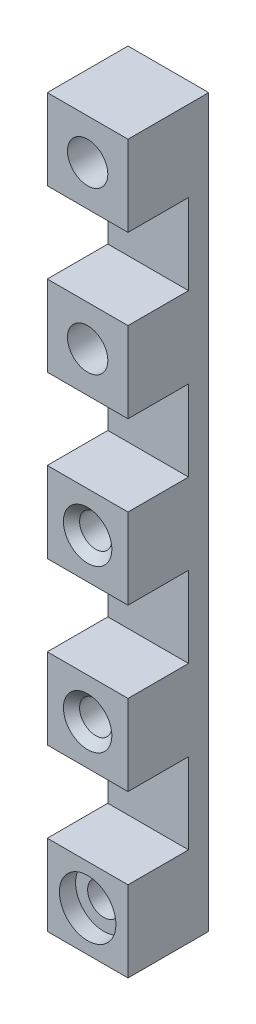
ISO-10303-21;
HEADER;
FILE_DESCRIPTION(('STEP AP214'),'2;1');
FILE_NAME('part.step','',(''),(''),'','','');
FILE_SCHEMA(('AUTOMOTIVE_DESIGN { 1 0 10303 214 1 1 1 1 }'));
ENDSEC;
DATA;
#1=APPLICATION_CONTEXT('core data for automotive mechanical design processes');
#2=APPLICATION_PROTOCOL_DEFINITION('international standard','automotive_design',2000,#1);
#3=PRODUCT_CONTEXT('',#1,'mechanical');
#4=PRODUCT('Part','Part','',(#3));
#5=PRODUCT_RELATED_PRODUCT_CATEGORY('part','',(#4));
#6=PRODUCT_DEFINITION_FORMATION('','',#4);
#7=PRODUCT_DEFINITION_CONTEXT('part definition',#1,'design');
#8=PRODUCT_DEFINITION('design','',#6,#7);
#9=PRODUCT_DEFINITION_SHAPE('','',#8);
#10=(LENGTH_UNIT() NAMED_UNIT(*) SI_UNIT(.MILLI.,.METRE.));
#11=(NAMED_UNIT(*) PLANE_ANGLE_UNIT() SI_UNIT($,.RADIAN.));
#12=(NAMED_UNIT(*) SI_UNIT($,.STERADIAN.) SOLID_ANGLE_UNIT());
#13=UNCERTAINTY_MEASURE_WITH_UNIT(LENGTH_MEASURE(1.E-05),#10,'distance_accuracy_value','');
#14=(GEOMETRIC_REPRESENTATION_CONTEXT(3) GLOBAL_UNCERTAINTY_ASSIGNED_CONTEXT((#13)) GLOBAL_UNIT_ASSIGNED_CONTEXT((#10,
#11,#12)) REPRESENTATION_CONTEXT('',''));
#15=CARTESIAN_POINT('',(0.,0.,0.));
#16=DIRECTION('',(0.,0.,1.));
#17=DIRECTION('',(1.,0.,0.));
#18=AXIS2_PLACEMENT_3D('',#15,#16,#17);
#19=CARTESIAN_POINT('',(0.,0.,15.));
#20=DIRECTION('',(0.,1.,0.));
#21=DIRECTION('',(0.,0.,1.));
#22=AXIS2_PLACEMENT_3D('',#19,#20,#21);
#23=PLANE('',#22);
#24=DIRECTION('',(1.,0.,0.));
#25=VECTOR('',#24,1.);
#26=CARTESIAN_POINT('',(0.,0.,0.));
#27=LINE('',#26,#25);
#28=CARTESIAN_POINT('',(-10.,0.,0.));
#29=VERTEX_POINT('',#28);
#30=CARTESIAN_POINT('',(10.,0.,0.));
#31=VERTEX_POINT('',#30);
#32=EDGE_CURVE('E343',#29,#31,#27,.T.);
#33=ORIENTED_EDGE('',*,*,#32,.T.);
#34=DIRECTION('',(0.,0.,-1.));
#35=VECTOR('',#34,1.);
#36=CARTESIAN_POINT('',(10.,0.,15.));
#37=LINE('',#36,#35);
#38=CARTESIAN_POINT('',(10.,0.,15.));
#39=VERTEX_POINT('',#38);
#40=EDGE_CURVE('E11',#39,#31,#37,.T.);
#41=ORIENTED_EDGE('',*,*,#40,.F.);
#42=DIRECTION('',(1.,0.,0.));
#43=VECTOR('',#42,1.);
#44=CARTESIAN_POINT('',(0.,0.,15.));
#45=LINE('',#44,#43);
#46=CARTESIAN_POINT('',(-9.99999999999999,0.,15.));
#47=VERTEX_POINT('',#46);
#48=EDGE_CURVE('E347',#47,#39,#45,.T.);
#49=ORIENTED_EDGE('',*,*,#48,.F.);
#50=DIRECTION('',(0.,0.,-1.));
#51=VECTOR('',#50,1.);
#52=CARTESIAN_POINT('',(-9.99999999999999,0.,15.));
#53=LINE('',#52,#51);
#54=EDGE_CURVE('E56',#47,#29,#53,.T.);
#55=ORIENTED_EDGE('',*,*,#54,.T.);
#56=EDGE_LOOP('',(#33,#41,#49,#55));
#57=FACE_BOUND('',#56,.T.);
#58=ADVANCED_FACE('F38',(#57),#23,.F.);
#59=CARTESIAN_POINT('',(9.99999999999999,0.,15.));
#60=DIRECTION('',(-1.,0.,0.));
#61=DIRECTION('',(0.,0.,1.));
#62=AXIS2_PLACEMENT_3D('',#59,#60,#61);
#63=PLANE('',#62);
#64=ORIENTED_EDGE('',*,*,#40,.T.);
#65=DIRECTION('',(0.,1.,0.));
#66=VECTOR('',#65,1.);
#67=CARTESIAN_POINT('',(9.99999999999999,0.,0.));
#68=LINE('',#67,#66);
#69=CARTESIAN_POINT('',(9.99999999999999,-20.,0.));
#70=VERTEX_POINT('',#69);
#71=EDGE_CURVE('E375',#70,#31,#68,.T.);
#72=ORIENTED_EDGE('',*,*,#71,.F.);
#73=DIRECTION('',(0.,0.,-1.));
#74=VECTOR('',#73,1.);
#75=CARTESIAN_POINT('',(9.99999999999999,-20.,15.));
#76=LINE('',#75,#74);
#77=CARTESIAN_POINT('',(9.99999999999999,-20.,15.));
#78=VERTEX_POINT('',#77);
#79=EDGE_CURVE('E394',#78,#70,#76,.T.);
#80=ORIENTED_EDGE('',*,*,#79,.F.);
#81=DIRECTION('',(0.,1.,0.));
#82=VECTOR('',#81,1.);
#83=CARTESIAN_POINT('',(9.99999999999999,-40.,15.));
#84=LINE('',#83,#82);
#85=CARTESIAN_POINT('',(10.,-40.,15.));
#86=VERTEX_POINT('',#85);
#87=EDGE_CURVE('E432',#86,#78,#84,.T.);
#88=ORIENTED_EDGE('',*,*,#87,.F.);
#89=DIRECTION('',(0.,0.,-1.));
#90=VECTOR('',#89,1.);
#91=CARTESIAN_POINT('',(10.,-40.,15.));
#92=LINE('',#91,#90);
#93=CARTESIAN_POINT('',(10.,-40.,0.));
#94=VERTEX_POINT('',#93);
#95=EDGE_CURVE('E389',#86,#94,#92,.T.);
#96=ORIENTED_EDGE('',*,*,#95,.T.);
#97=DIRECTION('',(0.,1.,0.));
#98=VECTOR('',#97,1.);
#99=CARTESIAN_POINT('',(9.99999999999999,-40.,0.));
#100=LINE('',#99,#98);
#101=CARTESIAN_POINT('',(9.99999999999999,-60.,0.));
#102=VERTEX_POINT('',#101);
#103=EDGE_CURVE('E412',#102,#94,#100,.T.);
#104=ORIENTED_EDGE('',*,*,#103,.F.);
#105=DIRECTION('',(0.,0.,-1.));
#106=VECTOR('',#105,1.);
#107=CARTESIAN_POINT('',(9.99999999999999,-60.,15.));
#108=LINE('',#107,#106);
#109=CARTESIAN_POINT('',(9.99999999999999,-60.,15.));
#110=VERTEX_POINT('',#109);
#111=EDGE_CURVE('E904',#110,#102,#108,.T.);
#112=ORIENTED_EDGE('',*,*,#111,.F.);
#113=DIRECTION('',(0.,1.,0.));
#114=VECTOR('',#113,1.);
#115=CARTESIAN_POINT('',(9.99999999999999,-80.,15.));
#116=LINE('',#115,#114);
#117=CARTESIAN_POINT('',(10.,-80.,15.));
#118=VERTEX_POINT('',#117);
#119=EDGE_CURVE('E932',#118,#110,#116,.T.);
#120=ORIENTED_EDGE('',*,*,#119,.F.);
#121=DIRECTION('',(0.,0.,-1.));
#122=VECTOR('',#121,1.);
#123=CARTESIAN_POINT('',(10.,-80.,15.));
#124=LINE('',#123,#122);
#125=CARTESIAN_POINT('',(10.,-80.,0.));
#126=VERTEX_POINT('',#125);
#127=EDGE_CURVE('E907',#118,#126,#124,.T.);
#128=ORIENTED_EDGE('',*,*,#127,.T.);
#129=DIRECTION('',(0.,1.,0.));
#130=VECTOR('',#129,1.);
#131=CARTESIAN_POINT('',(9.99999999999999,-80.,0.));
#132=LINE('',#131,#130);
#133=CARTESIAN_POINT('',(9.99999999999999,-100.,0.));
#134=VERTEX_POINT('',#133);
#135=EDGE_CURVE('E889',#134,#126,#132,.T.);
#136=ORIENTED_EDGE('',*,*,#135,.F.);
#137=DIRECTION('',(0.,0.,-1.));
#138=VECTOR('',#137,1.);
#139=CARTESIAN_POINT('',(9.99999999999999,-100.,15.));
#140=LINE('',#139,#138);
#141=CARTESIAN_POINT('',(9.99999999999999,-100.,15.));
#142=VERTEX_POINT('',#141);
#143=EDGE_CURVE('E278',#142,#134,#140,.T.);
#144=ORIENTED_EDGE('',*,*,#143,.F.);
#145=DIRECTION('',(0.,1.,0.));
#146=VECTOR('',#145,1.);
#147=CARTESIAN_POINT('',(9.99999999999999,-120.,15.));
#148=LINE('',#147,#146);
#149=CARTESIAN_POINT('',(10.,-120.,15.));
#150=VERTEX_POINT('',#149);
#151=EDGE_CURVE('E242',#150,#142,#148,.T.);
#152=ORIENTED_EDGE('',*,*,#151,.F.);
#153=DIRECTION('',(0.,0.,-1.));
#154=VECTOR('',#153,1.);
#155=CARTESIAN_POINT('',(10.,-120.,15.));
#156=LINE('',#155,#154);
#157=CARTESIAN_POINT('',(10.,-120.,0.));
#158=VERTEX_POINT('',#157);
#159=EDGE_CURVE('E272',#150,#158,#156,.T.);
#160=ORIENTED_EDGE('',*,*,#159,.T.);
#161=DIRECTION('',(0.,1.,0.));
#162=VECTOR('',#161,1.);
#163=CARTESIAN_POINT('',(9.99999999999999,-120.,0.));
#164=LINE('',#163,#162);
#165=CARTESIAN_POINT('',(9.99999999999999,-140.,0.));
#166=VERTEX_POINT('',#165);
#167=EDGE_CURVE('E236',#166,#158,#164,.T.);
#168=ORIENTED_EDGE('',*,*,#167,.F.);
#169=DIRECTION('',(0.,0.,-1.));
#170=VECTOR('',#169,1.);
#171=CARTESIAN_POINT('',(9.99999999999999,-140.,15.));
#172=LINE('',#171,#170);
#173=CARTESIAN_POINT('',(9.99999999999999,-140.,15.));
#174=VERTEX_POINT('',#173);
#175=EDGE_CURVE('E197',#174,#166,#172,.T.);
#176=ORIENTED_EDGE('',*,*,#175,.F.);
#177=DIRECTION('',(0.,1.,0.));
#178=VECTOR('',#177,1.);
#179=CARTESIAN_POINT('',(9.99999999999999,-160.,15.));
#180=LINE('',#179,#178);
#181=CARTESIAN_POINT('',(10.,-160.,15.));
#182=VERTEX_POINT('',#181);
#183=EDGE_CURVE('E192',#182,#174,#180,.T.);
#184=ORIENTED_EDGE('',*,*,#183,.F.);
#185=DIRECTION('',(0.,0.,-1.));
#186=VECTOR('',#185,1.);
#187=CARTESIAN_POINT('',(10.,-160.,15.));
#188=LINE('',#187,#186);
#189=CARTESIAN_POINT('',(10.,-160.,-5.));
#190=VERTEX_POINT('',#189);
#191=EDGE_CURVE('E189',#182,#190,#188,.T.);
#192=ORIENTED_EDGE('',*,*,#191,.T.);
#193=DIRECTION('',(0.,1.,0.));
#194=VECTOR('',#193,1.);
#195=CARTESIAN_POINT('',(9.99999999999999,0.,-5.));
#196=LINE('',#195,#194);
#197=CARTESIAN_POINT('',(9.99999999999999,20.,-5.));
#198=VERTEX_POINT('',#197);
#199=EDGE_CURVE('E175',#190,#198,#196,.T.);
#200=ORIENTED_EDGE('',*,*,#199,.T.);
#201=DIRECTION('',(0.,0.,-1.));
#202=VECTOR('',#201,1.);
#203=CARTESIAN_POINT('',(9.99999999999999,20.,15.));
#204=LINE('',#203,#202);
#205=CARTESIAN_POINT('',(9.99999999999999,20.,15.));
#206=VERTEX_POINT('',#205);
#207=EDGE_CURVE('E48',#206,#198,#204,.T.);
#208=ORIENTED_EDGE('',*,*,#207,.F.);
#209=DIRECTION('',(0.,1.,0.));
#210=VECTOR('',#209,1.);
#211=CARTESIAN_POINT('',(9.99999999999999,0.,15.));
#212=LINE('',#211,#210);
#213=EDGE_CURVE('E350',#39,#206,#212,.T.);
#214=ORIENTED_EDGE('',*,*,#213,.F.);
#215=EDGE_LOOP('',(#64,#72,#80,#88,#96,#104,#112,#120,#128,#136,#144,#152,#160,#168,#176,#184,
#192,#200,#208,#214));
#216=FACE_BOUND('',#215,.T.);
#217=ADVANCED_FACE('F190',(#216),#63,.F.);
#218=CARTESIAN_POINT('',(0.,20.,15.));
#219=DIRECTION('',(0.,1.,0.));
#220=DIRECTION('',(0.,0.,1.));
#221=AXIS2_PLACEMENT_3D('',#218,#219,#220);
#222=PLANE('',#221);
#223=ORIENTED_EDGE('',*,*,#207,.T.);
#224=DIRECTION('',(1.,0.,0.));
#225=VECTOR('',#224,1.);
#226=CARTESIAN_POINT('',(0.,20.,-5.));
#227=LINE('',#226,#225);
#228=CARTESIAN_POINT('',(-10.,20.,-5.));
#229=VERTEX_POINT('',#228);
#230=EDGE_CURVE('E183',#229,#198,#227,.T.);
#231=ORIENTED_EDGE('',*,*,#230,.F.);
#232=DIRECTION('',(0.,0.,-1.));
#233=VECTOR('',#232,1.);
#234=CARTESIAN_POINT('',(-10.,20.,15.));
#235=LINE('',#234,#233);
#236=CARTESIAN_POINT('',(-10.,20.,15.));
#237=VERTEX_POINT('',#236);
#238=EDGE_CURVE('E363',#237,#229,#235,.T.);
#239=ORIENTED_EDGE('',*,*,#238,.F.);
#240=DIRECTION('',(1.,0.,0.));
#241=VECTOR('',#240,1.);
#242=CARTESIAN_POINT('',(0.,20.,15.));
#243=LINE('',#242,#241);
#244=EDGE_CURVE('E368',#237,#206,#243,.T.);
#245=ORIENTED_EDGE('',*,*,#244,.T.);
#246=EDGE_LOOP('',(#223,#231,#239,#245));
#247=FACE_BOUND('',#246,.T.);
#248=ADVANCED_FACE('F340',(#247),#222,.T.);
#249=CARTESIAN_POINT('',(-10.,0.,15.));
#250=DIRECTION('',(-1.,0.,0.));
#251=DIRECTION('',(0.,0.,1.));
#252=AXIS2_PLACEMENT_3D('',#249,#250,#251);
#253=PLANE('',#252);
#254=ORIENTED_EDGE('',*,*,#238,.T.);
#255=DIRECTION('',(0.,1.,0.));
#256=VECTOR('',#255,1.);
#257=CARTESIAN_POINT('',(-10.,0.,-5.));
#258=LINE('',#257,#256);
#259=CARTESIAN_POINT('',(-10.,-160.,-5.));
#260=VERTEX_POINT('',#259);
#261=EDGE_CURVE('E186',#260,#229,#258,.T.);
#262=ORIENTED_EDGE('',*,*,#261,.F.);
#263=DIRECTION('',(0.,0.,-1.));
#264=VECTOR('',#263,1.);
#265=CARTESIAN_POINT('',(-9.99999999999999,-160.,15.));
#266=LINE('',#265,#264);
#267=CARTESIAN_POINT('',(-9.99999999999999,-160.,15.));
#268=VERTEX_POINT('',#267);
#269=EDGE_CURVE('E201',#268,#260,#266,.T.);
#270=ORIENTED_EDGE('',*,*,#269,.F.);
#271=DIRECTION('',(0.,1.,0.));
#272=VECTOR('',#271,1.);
#273=CARTESIAN_POINT('',(-10.,-160.,15.));
#274=LINE('',#273,#272);
#275=CARTESIAN_POINT('',(-10.,-140.,15.));
#276=VERTEX_POINT('',#275);
#277=EDGE_CURVE('E216',#268,#276,#274,.T.);
#278=ORIENTED_EDGE('',*,*,#277,.T.);
#279=DIRECTION('',(0.,0.,-1.));
#280=VECTOR('',#279,1.);
#281=CARTESIAN_POINT('',(-10.,-140.,15.));
#282=LINE('',#281,#280);
#283=CARTESIAN_POINT('',(-10.,-140.,0.));
#284=VERTEX_POINT('',#283);
#285=EDGE_CURVE('E221',#276,#284,#282,.T.);
#286=ORIENTED_EDGE('',*,*,#285,.T.);
#287=DIRECTION('',(0.,1.,0.));
#288=VECTOR('',#287,1.);
#289=CARTESIAN_POINT('',(-10.,-120.,0.));
#290=LINE('',#289,#288);
#291=CARTESIAN_POINT('',(-10.,-120.,0.));
#292=VERTEX_POINT('',#291);
#293=EDGE_CURVE('E231',#284,#292,#290,.T.);
#294=ORIENTED_EDGE('',*,*,#293,.T.);
#295=DIRECTION('',(0.,0.,-1.));
#296=VECTOR('',#295,1.);
#297=CARTESIAN_POINT('',(-9.99999999999999,-120.,15.));
#298=LINE('',#297,#296);
#299=CARTESIAN_POINT('',(-9.99999999999999,-120.,15.));
#300=VERTEX_POINT('',#299);
#301=EDGE_CURVE('E250',#300,#292,#298,.T.);
#302=ORIENTED_EDGE('',*,*,#301,.F.);
#303=DIRECTION('',(0.,1.,0.));
#304=VECTOR('',#303,1.);
#305=CARTESIAN_POINT('',(-10.,-120.,15.));
#306=LINE('',#305,#304);
#307=CARTESIAN_POINT('',(-10.,-100.,15.));
#308=VERTEX_POINT('',#307);
#309=EDGE_CURVE('E247',#300,#308,#306,.T.);
#310=ORIENTED_EDGE('',*,*,#309,.T.);
#311=DIRECTION('',(0.,0.,-1.));
#312=VECTOR('',#311,1.);
#313=CARTESIAN_POINT('',(-10.,-100.,15.));
#314=LINE('',#313,#312);
#315=CARTESIAN_POINT('',(-10.,-100.,0.));
#316=VERTEX_POINT('',#315);
#317=EDGE_CURVE('E263',#308,#316,#314,.T.);
#318=ORIENTED_EDGE('',*,*,#317,.T.);
#319=DIRECTION('',(0.,1.,0.));
#320=VECTOR('',#319,1.);
#321=CARTESIAN_POINT('',(-10.,-80.,0.));
#322=LINE('',#321,#320);
#323=CARTESIAN_POINT('',(-10.,-80.,0.));
#324=VERTEX_POINT('',#323);
#325=EDGE_CURVE('E882',#316,#324,#322,.T.);
#326=ORIENTED_EDGE('',*,*,#325,.T.);
#327=DIRECTION('',(0.,0.,-1.));
#328=VECTOR('',#327,1.);
#329=CARTESIAN_POINT('',(-9.99999999999999,-80.,15.));
#330=LINE('',#329,#328);
#331=CARTESIAN_POINT('',(-9.99999999999999,-80.,15.));
#332=VERTEX_POINT('',#331);
#333=EDGE_CURVE('E922',#332,#324,#330,.T.);
#334=ORIENTED_EDGE('',*,*,#333,.F.);
#335=DIRECTION('',(0.,1.,0.));
#336=VECTOR('',#335,1.);
#337=CARTESIAN_POINT('',(-10.,-80.,15.));
#338=LINE('',#337,#336);
#339=CARTESIAN_POINT('',(-10.,-60.,15.));
#340=VERTEX_POINT('',#339);
#341=EDGE_CURVE('E926',#332,#340,#338,.T.);
#342=ORIENTED_EDGE('',*,*,#341,.T.);
#343=DIRECTION('',(0.,0.,-1.));
#344=VECTOR('',#343,1.);
#345=CARTESIAN_POINT('',(-10.,-60.,15.));
#346=LINE('',#345,#344);
#347=CARTESIAN_POINT('',(-10.,-60.,0.));
#348=VERTEX_POINT('',#347);
#349=EDGE_CURVE('E908',#340,#348,#346,.T.);
#350=ORIENTED_EDGE('',*,*,#349,.T.);
#351=DIRECTION('',(0.,1.,0.));
#352=VECTOR('',#351,1.);
#353=CARTESIAN_POINT('',(-10.,-40.,0.));
#354=LINE('',#353,#352);
#355=CARTESIAN_POINT('',(-10.,-40.,0.));
#356=VERTEX_POINT('',#355);
#357=EDGE_CURVE('E420',#348,#356,#354,.T.);
#358=ORIENTED_EDGE('',*,*,#357,.T.);
#359=DIRECTION('',(0.,0.,-1.));
#360=VECTOR('',#359,1.);
#361=CARTESIAN_POINT('',(-9.99999999999999,-40.,15.));
#362=LINE('',#361,#360);
#363=CARTESIAN_POINT('',(-9.99999999999999,-40.,15.));
#364=VERTEX_POINT('',#363);
#365=EDGE_CURVE('E395',#364,#356,#362,.T.);
#366=ORIENTED_EDGE('',*,*,#365,.F.);
#367=DIRECTION('',(0.,1.,0.));
#368=VECTOR('',#367,1.);
#369=CARTESIAN_POINT('',(-10.,-40.,15.));
#370=LINE('',#369,#368);
#371=CARTESIAN_POINT('',(-10.,-20.,15.));
#372=VERTEX_POINT('',#371);
#373=EDGE_CURVE('E415',#364,#372,#370,.T.);
#374=ORIENTED_EDGE('',*,*,#373,.T.);
#375=DIRECTION('',(0.,0.,-1.));
#376=VECTOR('',#375,1.);
#377=CARTESIAN_POINT('',(-10.,-20.,15.));
#378=LINE('',#377,#376);
#379=CARTESIAN_POINT('',(-10.,-20.,0.));
#380=VERTEX_POINT('',#379);
#381=EDGE_CURVE('E390',#372,#380,#378,.T.);
#382=ORIENTED_EDGE('',*,*,#381,.T.);
#383=DIRECTION('',(0.,1.,0.));
#384=VECTOR('',#383,1.);
#385=CARTESIAN_POINT('',(-10.,0.,0.));
#386=LINE('',#385,#384);
#387=EDGE_CURVE('E378',#380,#29,#386,.T.);
#388=ORIENTED_EDGE('',*,*,#387,.T.);
#389=ORIENTED_EDGE('',*,*,#54,.F.);
#390=DIRECTION('',(0.,1.,0.));
#391=VECTOR('',#390,1.);
#392=CARTESIAN_POINT('',(-10.,0.,15.));
#393=LINE('',#392,#391);
#394=EDGE_CURVE('E361',#47,#237,#393,.T.);
#395=ORIENTED_EDGE('',*,*,#394,.T.);
#396=EDGE_LOOP('',(#254,#262,#270,#278,#286,#294,#302,#310,#318,#326,#334,#342,#350,#358,#366,
#374,#382,#388,#389,#395));
#397=FACE_BOUND('',#396,.T.);
#398=ADVANCED_FACE('F292',(#397),#253,.T.);
#399=CARTESIAN_POINT('',(0.,0.,15.));
#400=DIRECTION('',(0.,0.,1.));
#401=DIRECTION('',(1.,0.,0.));
#402=AXIS2_PLACEMENT_3D('',#399,#400,#401);
#403=PLANE('',#402);
#404=CARTESIAN_POINT('',(0.,10.,15.));
#405=DIRECTION('',(0.,0.,1.));
#406=DIRECTION('',(1.,0.,0.));
#407=AXIS2_PLACEMENT_3D('',#404,#405,#406);
#408=CIRCLE('',#407,5.);
#409=CARTESIAN_POINT('',(5.,10.,15.));
#410=VERTEX_POINT('',#409);
#411=EDGE_CURVE('E385',#410,#410,#408,.T.);
#412=ORIENTED_EDGE('',*,*,#411,.F.);
#413=EDGE_LOOP('',(#412));
#414=FACE_BOUND('',#413,.T.);
#415=ORIENTED_EDGE('',*,*,#48,.T.);
#416=ORIENTED_EDGE('',*,*,#213,.T.);
#417=ORIENTED_EDGE('',*,*,#244,.F.);
#418=ORIENTED_EDGE('',*,*,#394,.F.);
#419=EDGE_LOOP('',(#415,#416,#417,#418));
#420=FACE_BOUND('',#419,.T.);
#421=ADVANCED_FACE('F373',(#414,#420),#403,.T.);
#422=CARTESIAN_POINT('',(0.,0.,0.));
#423=DIRECTION('',(0.,0.,1.));
#424=DIRECTION('',(1.,0.,0.));
#425=AXIS2_PLACEMENT_3D('',#422,#423,#424);
#426=PLANE('',#425);
#427=ORIENTED_EDGE('',*,*,#32,.F.);
#428=ORIENTED_EDGE('',*,*,#387,.F.);
#429=DIRECTION('',(1.,0.,0.));
#430=VECTOR('',#429,1.);
#431=CARTESIAN_POINT('',(0.,-20.,0.));
#432=LINE('',#431,#430);
#433=EDGE_CURVE('E41',#380,#70,#432,.T.);
#434=ORIENTED_EDGE('',*,*,#433,.T.);
#435=ORIENTED_EDGE('',*,*,#71,.T.);
#436=EDGE_LOOP('',(#427,#428,#434,#435));
#437=FACE_BOUND('',#436,.T.);
#438=ADVANCED_FACE('F463',(#437),#426,.T.);
#439=CARTESIAN_POINT('',(0.,0.,-5.));
#440=DIRECTION('',(0.,0.,1.));
#441=DIRECTION('',(1.,0.,0.));
#442=AXIS2_PLACEMENT_3D('',#439,#440,#441);
#443=PLANE('',#442);
#444=CARTESIAN_POINT('',(0.,10.,-5.));
#445=DIRECTION('',(0.,0.,1.));
#446=DIRECTION('',(1.,0.,0.));
#447=AXIS2_PLACEMENT_3D('',#444,#445,#446);
#448=CIRCLE('',#447,5.);
#449=CARTESIAN_POINT('',(5.,10.,-5.));
#450=VERTEX_POINT('',#449);
#451=EDGE_CURVE('E388',#450,#450,#448,.T.);
#452=ORIENTED_EDGE('',*,*,#451,.T.);
#453=EDGE_LOOP('',(#452));
#454=FACE_BOUND('',#453,.T.);
#455=ORIENTED_EDGE('',*,*,#261,.T.);
#456=ORIENTED_EDGE('',*,*,#230,.T.);
#457=ORIENTED_EDGE('',*,*,#199,.F.);
#458=DIRECTION('',(-1.,0.,0.));
#459=VECTOR('',#458,1.);
#460=CARTESIAN_POINT('',(10.,-160.,-5.));
#461=LINE('',#460,#459);
#462=EDGE_CURVE('E181',#190,#260,#461,.T.);
#463=ORIENTED_EDGE('',*,*,#462,.T.);
#464=EDGE_LOOP('',(#455,#456,#457,#463));
#465=FACE_BOUND('',#464,.T.);
#466=CARTESIAN_POINT('',(0.,-70.,-5.));
#467=DIRECTION('',(0.,0.,1.));
#468=DIRECTION('',(1.,0.,0.));
#469=AXIS2_PLACEMENT_3D('',#466,#467,#468);
#470=CIRCLE('',#469,4.);
#471=CARTESIAN_POINT('',(4.,-70.,-5.));
#472=VERTEX_POINT('',#471);
#473=EDGE_CURVE('E275',#472,#472,#470,.T.);
#474=ORIENTED_EDGE('',*,*,#473,.T.);
#475=EDGE_LOOP('',(#474));
#476=FACE_BOUND('',#475,.T.);
#477=CARTESIAN_POINT('',(0.,-110.,-5.));
#478=DIRECTION('',(0.,0.,1.));
#479=DIRECTION('',(1.,0.,0.));
#480=AXIS2_PLACEMENT_3D('',#477,#478,#479);
#481=CIRCLE('',#480,4.);
#482=CARTESIAN_POINT('',(4.,-110.,-5.));
#483=VERTEX_POINT('',#482);
#484=EDGE_CURVE('E196',#483,#483,#481,.T.);
#485=ORIENTED_EDGE('',*,*,#484,.T.);
#486=EDGE_LOOP('',(#485));
#487=FACE_BOUND('',#486,.T.);
#488=CARTESIAN_POINT('',(0.,-150.,-5.));
#489=DIRECTION('',(0.,0.,1.));
#490=DIRECTION('',(1.,0.,0.));
#491=AXIS2_PLACEMENT_3D('',#488,#489,#490);
#492=CIRCLE('',#491,4.);
#493=CARTESIAN_POINT('',(4.,-150.,-5.));
#494=VERTEX_POINT('',#493);
#495=EDGE_CURVE('E203',#494,#494,#492,.T.);
#496=ORIENTED_EDGE('',*,*,#495,.T.);
#497=EDGE_LOOP('',(#496));
#498=FACE_BOUND('',#497,.T.);
#499=ADVANCED_FACE('F178',(#454,#465,#476,#487,#498),#443,.F.);
#500=CARTESIAN_POINT('',(0.,10.,-5.000025));
#501=DIRECTION('',(0.,0.,1.));
#502=DIRECTION('',(1.,0.,0.));
#503=AXIS2_PLACEMENT_3D('',#500,#501,#502);
#504=CYLINDRICAL_SURFACE('',#503,5.);
#505=ORIENTED_EDGE('',*,*,#411,.T.);
#506=EDGE_LOOP('',(#505));
#507=FACE_BOUND('',#506,.T.);
#508=ORIENTED_EDGE('',*,*,#451,.F.);
#509=EDGE_LOOP('',(#508));
#510=FACE_BOUND('',#509,.T.);
#511=ADVANCED_FACE('F453',(#507,#510),#504,.F.);
#512=CARTESIAN_POINT('',(0.,-20.,15.));
#513=DIRECTION('',(0.,1.,0.));
#514=DIRECTION('',(0.,0.,1.));
#515=AXIS2_PLACEMENT_3D('',#512,#513,#514);
#516=PLANE('',#515);
#517=ORIENTED_EDGE('',*,*,#433,.F.);
#518=ORIENTED_EDGE('',*,*,#381,.F.);
#519=DIRECTION('',(1.,0.,0.));
#520=VECTOR('',#519,1.);
#521=CARTESIAN_POINT('',(0.,-20.,15.));
#522=LINE('',#521,#520);
#523=EDGE_CURVE('E434',#372,#78,#522,.T.);
#524=ORIENTED_EDGE('',*,*,#523,.T.);
#525=ORIENTED_EDGE('',*,*,#79,.T.);
#526=EDGE_LOOP('',(#517,#518,#524,#525));
#527=FACE_BOUND('',#526,.T.);
#528=ADVANCED_FACE('F446',(#527),#516,.T.);
#529=CARTESIAN_POINT('',(0.,-40.,15.));
#530=DIRECTION('',(0.,1.,0.));
#531=DIRECTION('',(0.,0.,1.));
#532=AXIS2_PLACEMENT_3D('',#529,#530,#531);
#533=PLANE('',#532);
#534=DIRECTION('',(1.,0.,0.));
#535=VECTOR('',#534,1.);
#536=CARTESIAN_POINT('',(0.,-40.,0.));
#537=LINE('',#536,#535);
#538=EDGE_CURVE('E408',#356,#94,#537,.T.);
#539=ORIENTED_EDGE('',*,*,#538,.T.);
#540=ORIENTED_EDGE('',*,*,#95,.F.);
#541=DIRECTION('',(1.,0.,0.));
#542=VECTOR('',#541,1.);
#543=CARTESIAN_POINT('',(0.,-40.,15.));
#544=LINE('',#543,#542);
#545=EDGE_CURVE('E411',#364,#86,#544,.T.);
#546=ORIENTED_EDGE('',*,*,#545,.F.);
#547=ORIENTED_EDGE('',*,*,#365,.T.);
#548=EDGE_LOOP('',(#539,#540,#546,#547));
#549=FACE_BOUND('',#548,.T.);
#550=ADVANCED_FACE('F461',(#549),#533,.F.);
#551=CARTESIAN_POINT('',(0.,-40.,15.));
#552=DIRECTION('',(0.,0.,1.));
#553=DIRECTION('',(1.,0.,0.));
#554=AXIS2_PLACEMENT_3D('',#551,#552,#553);
#555=PLANE('',#554);
#556=CARTESIAN_POINT('',(0.,-30.,15.));
#557=DIRECTION('',(0.,0.,1.));
#558=DIRECTION('',(1.,0.,0.));
#559=AXIS2_PLACEMENT_3D('',#556,#557,#558);
#560=CIRCLE('',#559,5.);
#561=CARTESIAN_POINT('',(5.,-30.,15.));
#562=VERTEX_POINT('',#561);
#563=EDGE_CURVE('E946',#562,#562,#560,.T.);
#564=ORIENTED_EDGE('',*,*,#563,.F.);
#565=EDGE_LOOP('',(#564));
#566=FACE_BOUND('',#565,.T.);
#567=ORIENTED_EDGE('',*,*,#545,.T.);
#568=ORIENTED_EDGE('',*,*,#87,.T.);
#569=ORIENTED_EDGE('',*,*,#523,.F.);
#570=ORIENTED_EDGE('',*,*,#373,.F.);
#571=EDGE_LOOP('',(#567,#568,#569,#570));
#572=FACE_BOUND('',#571,.T.);
#573=ADVANCED_FACE('F442',(#566,#572),#555,.T.);
#574=CARTESIAN_POINT('',(0.,-40.,0.));
#575=DIRECTION('',(0.,0.,1.));
#576=DIRECTION('',(1.,0.,0.));
#577=AXIS2_PLACEMENT_3D('',#574,#575,#576);
#578=PLANE('',#577);
#579=ORIENTED_EDGE('',*,*,#538,.F.);
#580=ORIENTED_EDGE('',*,*,#357,.F.);
#581=DIRECTION('',(1.,0.,0.));
#582=VECTOR('',#581,1.);
#583=CARTESIAN_POINT('',(0.,-60.,0.));
#584=LINE('',#583,#582);
#585=EDGE_CURVE('E417',#348,#102,#584,.T.);
#586=ORIENTED_EDGE('',*,*,#585,.T.);
#587=ORIENTED_EDGE('',*,*,#103,.T.);
#588=EDGE_LOOP('',(#579,#580,#586,#587));
#589=FACE_BOUND('',#588,.T.);
#590=ADVANCED_FACE('F516',(#589),#578,.T.);
#591=CARTESIAN_POINT('',(0.,-30.,0.));
#592=DIRECTION('',(0.,0.,1.));
#593=DIRECTION('',(1.,0.,0.));
#594=AXIS2_PLACEMENT_3D('',#591,#592,#593);
#595=CYLINDRICAL_SURFACE('',#594,5.);
#596=CARTESIAN_POINT('',(0.,-30.,0.));
#597=DIRECTION('',(0.,0.,1.));
#598=DIRECTION('',(1.,0.,0.));
#599=AXIS2_PLACEMENT_3D('',#596,#597,#598);
#600=CIRCLE('',#599,5.);
#601=CARTESIAN_POINT('',(5.,-30.,0.));
#602=VERTEX_POINT('',#601);
#603=EDGE_CURVE('E944',#602,#602,#600,.T.);
#604=ORIENTED_EDGE('',*,*,#603,.F.);
#605=EDGE_LOOP('',(#604));
#606=FACE_BOUND('',#605,.T.);
#607=ORIENTED_EDGE('',*,*,#563,.T.);
#608=EDGE_LOOP('',(#607));
#609=FACE_BOUND('',#608,.T.);
#610=ADVANCED_FACE('F525',(#606,#609),#595,.F.);
#611=CARTESIAN_POINT('',(0.,-30.,0.));
#612=DIRECTION('',(0.,0.,1.));
#613=DIRECTION('',(1.,0.,0.));
#614=AXIS2_PLACEMENT_3D('',#611,#612,#613);
#615=PLANE('',#614);
#616=ORIENTED_EDGE('',*,*,#603,.T.);
#617=EDGE_LOOP('',(#616));
#618=FACE_BOUND('',#617,.T.);
#619=ADVANCED_FACE('F534',(#618),#615,.T.);
#620=CARTESIAN_POINT('',(0.,-60.,15.));
#621=DIRECTION('',(0.,1.,0.));
#622=DIRECTION('',(0.,0.,1.));
#623=AXIS2_PLACEMENT_3D('',#620,#621,#622);
#624=PLANE('',#623);
#625=ORIENTED_EDGE('',*,*,#585,.F.);
#626=ORIENTED_EDGE('',*,*,#349,.F.);
#627=DIRECTION('',(1.,0.,0.));
#628=VECTOR('',#627,1.);
#629=CARTESIAN_POINT('',(0.,-60.,15.));
#630=LINE('',#629,#628);
#631=EDGE_CURVE('E929',#340,#110,#630,.T.);
#632=ORIENTED_EDGE('',*,*,#631,.T.);
#633=ORIENTED_EDGE('',*,*,#111,.T.);
#634=EDGE_LOOP('',(#625,#626,#632,#633));
#635=FACE_BOUND('',#634,.T.);
#636=ADVANCED_FACE('F543',(#635),#624,.T.);
#637=CARTESIAN_POINT('',(0.,-80.,15.));
#638=DIRECTION('',(0.,1.,0.));
#639=DIRECTION('',(0.,0.,1.));
#640=AXIS2_PLACEMENT_3D('',#637,#638,#639);
#641=PLANE('',#640);
#642=DIRECTION('',(1.,0.,0.));
#643=VECTOR('',#642,1.);
#644=CARTESIAN_POINT('',(0.,-80.,0.));
#645=LINE('',#644,#643);
#646=EDGE_CURVE('E887',#324,#126,#645,.T.);
#647=ORIENTED_EDGE('',*,*,#646,.T.);
#648=ORIENTED_EDGE('',*,*,#127,.F.);
#649=DIRECTION('',(1.,0.,0.));
#650=VECTOR('',#649,1.);
#651=CARTESIAN_POINT('',(0.,-80.,15.));
#652=LINE('',#651,#650);
#653=EDGE_CURVE('E921',#332,#118,#652,.T.);
#654=ORIENTED_EDGE('',*,*,#653,.F.);
#655=ORIENTED_EDGE('',*,*,#333,.T.);
#656=EDGE_LOOP('',(#647,#648,#654,#655));
#657=FACE_BOUND('',#656,.T.);
#658=ADVANCED_FACE('F552',(#657),#641,.F.);
#659=CARTESIAN_POINT('',(0.,-80.,15.));
#660=DIRECTION('',(0.,0.,1.));
#661=DIRECTION('',(1.,0.,0.));
#662=AXIS2_PLACEMENT_3D('',#659,#660,#661);
#663=PLANE('',#662);
#664=CARTESIAN_POINT('',(0.,-70.,15.));
#665=DIRECTION('',(0.,0.,1.));
#666=DIRECTION('',(1.,0.,0.));
#667=AXIS2_PLACEMENT_3D('',#664,#665,#666);
#668=CIRCLE('',#667,6.00000000000001);
#669=CARTESIAN_POINT('',(6.00000000000001,-70.,15.));
#670=VERTEX_POINT('',#669);
#671=EDGE_CURVE('E902',#670,#670,#668,.F.);
#672=ORIENTED_EDGE('',*,*,#671,.T.);
#673=EDGE_LOOP('',(#672));
#674=FACE_BOUND('',#673,.T.);
#675=ORIENTED_EDGE('',*,*,#653,.T.);
#676=ORIENTED_EDGE('',*,*,#119,.T.);
#677=ORIENTED_EDGE('',*,*,#631,.F.);
#678=ORIENTED_EDGE('',*,*,#341,.F.);
#679=EDGE_LOOP('',(#675,#676,#677,#678));
#680=FACE_BOUND('',#679,.T.);
#681=ADVANCED_FACE('F561',(#674,#680),#663,.T.);
#682=CARTESIAN_POINT('',(0.,-80.,0.));
#683=DIRECTION('',(0.,0.,1.));
#684=DIRECTION('',(1.,0.,0.));
#685=AXIS2_PLACEMENT_3D('',#682,#683,#684);
#686=PLANE('',#685);
#687=ORIENTED_EDGE('',*,*,#646,.F.);
#688=ORIENTED_EDGE('',*,*,#325,.F.);
#689=DIRECTION('',(1.,0.,0.));
#690=VECTOR('',#689,1.);
#691=CARTESIAN_POINT('',(0.,-100.,0.));
#692=LINE('',#691,#690);
#693=EDGE_CURVE('E885',#316,#134,#692,.T.);
#694=ORIENTED_EDGE('',*,*,#693,.T.);
#695=ORIENTED_EDGE('',*,*,#135,.T.);
#696=EDGE_LOOP('',(#687,#688,#694,#695));
#697=FACE_BOUND('',#696,.T.);
#698=ADVANCED_FACE('F570',(#697),#686,.T.);
#699=CARTESIAN_POINT('',(0.,-70.,-5.000025));
#700=DIRECTION('',(0.,0.,1.));
#701=DIRECTION('',(1.,0.,0.));
#702=AXIS2_PLACEMENT_3D('',#699,#700,#701);
#703=CYLINDRICAL_SURFACE('',#702,4.);
#704=CARTESIAN_POINT('',(0.,-70.,13.));
#705=DIRECTION('',(0.,0.,1.));
#706=DIRECTION('',(1.,0.,0.));
#707=AXIS2_PLACEMENT_3D('',#704,#705,#706);
#708=CIRCLE('',#707,4.);
#709=CARTESIAN_POINT('',(4.,-70.,13.));
#710=VERTEX_POINT('',#709);
#711=EDGE_CURVE('E917',#710,#710,#708,.T.);
#712=ORIENTED_EDGE('',*,*,#711,.T.);
#713=EDGE_LOOP('',(#712));
#714=FACE_BOUND('',#713,.T.);
#715=ORIENTED_EDGE('',*,*,#473,.F.);
#716=EDGE_LOOP('',(#715));
#717=FACE_BOUND('',#716,.T.);
#718=ADVANCED_FACE('F579',(#714,#717),#703,.F.);
#719=CARTESIAN_POINT('',(0.,-70.,13.));
#720=DIRECTION('',(0.,0.,1.));
#721=DIRECTION('',(1.,0.,0.));
#722=AXIS2_PLACEMENT_3D('',#719,#720,#721);
#723=CONICAL_SURFACE('',#722,4.,0.785398163397451);
#724=ORIENTED_EDGE('',*,*,#671,.F.);
#725=EDGE_LOOP('',(#724));
#726=FACE_BOUND('',#725,.T.);
#727=ORIENTED_EDGE('',*,*,#711,.F.);
#728=EDGE_LOOP('',(#727));
#729=FACE_BOUND('',#728,.T.);
#730=ADVANCED_FACE('F588',(#726,#729),#723,.F.);
#731=CARTESIAN_POINT('',(0.,-100.,15.));
#732=DIRECTION('',(0.,1.,0.));
#733=DIRECTION('',(0.,0.,1.));
#734=AXIS2_PLACEMENT_3D('',#731,#732,#733);
#735=PLANE('',#734);
#736=ORIENTED_EDGE('',*,*,#693,.F.);
#737=ORIENTED_EDGE('',*,*,#317,.F.);
#738=DIRECTION('',(1.,0.,0.));
#739=VECTOR('',#738,1.);
#740=CARTESIAN_POINT('',(0.,-100.,15.));
#741=LINE('',#740,#739);
#742=EDGE_CURVE('E244',#308,#142,#741,.T.);
#743=ORIENTED_EDGE('',*,*,#742,.T.);
#744=ORIENTED_EDGE('',*,*,#143,.T.);
#745=EDGE_LOOP('',(#736,#737,#743,#744));
#746=FACE_BOUND('',#745,.T.);
#747=ADVANCED_FACE('F597',(#746),#735,.T.);
#748=CARTESIAN_POINT('',(0.,-120.,15.));
#749=DIRECTION('',(0.,1.,0.));
#750=DIRECTION('',(0.,0.,1.));
#751=AXIS2_PLACEMENT_3D('',#748,#749,#750);
#752=PLANE('',#751);
#753=DIRECTION('',(1.,0.,0.));
#754=VECTOR('',#753,1.);
#755=CARTESIAN_POINT('',(0.,-120.,0.));
#756=LINE('',#755,#754);
#757=EDGE_CURVE('E238',#292,#158,#756,.T.);
#758=ORIENTED_EDGE('',*,*,#757,.T.);
#759=ORIENTED_EDGE('',*,*,#159,.F.);
#760=DIRECTION('',(1.,0.,0.));
#761=VECTOR('',#760,1.);
#762=CARTESIAN_POINT('',(0.,-120.,15.));
#763=LINE('',#762,#761);
#764=EDGE_CURVE('E239',#300,#150,#763,.T.);
#765=ORIENTED_EDGE('',*,*,#764,.F.);
#766=ORIENTED_EDGE('',*,*,#301,.T.);
#767=EDGE_LOOP('',(#758,#759,#765,#766));
#768=FACE_BOUND('',#767,.T.);
#769=ADVANCED_FACE('F288',(#768),#752,.F.);
#770=CARTESIAN_POINT('',(0.,-120.,15.));
#771=DIRECTION('',(0.,0.,1.));
#772=DIRECTION('',(1.,0.,0.));
#773=AXIS2_PLACEMENT_3D('',#770,#771,#772);
#774=PLANE('',#773);
#775=CARTESIAN_POINT('',(0.,-110.,15.));
#776=DIRECTION('',(0.,0.,1.));
#777=DIRECTION('',(1.,0.,0.));
#778=AXIS2_PLACEMENT_3D('',#775,#776,#777);
#779=CIRCLE('',#778,6.00000000000001);
#780=CARTESIAN_POINT('',(6.00000000000001,-110.,15.));
#781=VERTEX_POINT('',#780);
#782=EDGE_CURVE('E271',#781,#781,#779,.F.);
#783=ORIENTED_EDGE('',*,*,#782,.T.);
#784=EDGE_LOOP('',(#783));
#785=FACE_BOUND('',#784,.T.);
#786=ORIENTED_EDGE('',*,*,#764,.T.);
#787=ORIENTED_EDGE('',*,*,#151,.T.);
#788=ORIENTED_EDGE('',*,*,#742,.F.);
#789=ORIENTED_EDGE('',*,*,#309,.F.);
#790=EDGE_LOOP('',(#786,#787,#788,#789));
#791=FACE_BOUND('',#790,.T.);
#792=ADVANCED_FACE('F614',(#785,#791),#774,.T.);
#793=CARTESIAN_POINT('',(0.,-120.,0.));
#794=DIRECTION('',(0.,0.,1.));
#795=DIRECTION('',(1.,0.,0.));
#796=AXIS2_PLACEMENT_3D('',#793,#794,#795);
#797=PLANE('',#796);
#798=ORIENTED_EDGE('',*,*,#757,.F.);
#799=ORIENTED_EDGE('',*,*,#293,.F.);
#800=DIRECTION('',(1.,0.,0.));
#801=VECTOR('',#800,1.);
#802=CARTESIAN_POINT('',(0.,-140.,0.));
#803=LINE('',#802,#801);
#804=EDGE_CURVE('E234',#284,#166,#803,.T.);
#805=ORIENTED_EDGE('',*,*,#804,.T.);
#806=ORIENTED_EDGE('',*,*,#167,.T.);
#807=EDGE_LOOP('',(#798,#799,#805,#806));
#808=FACE_BOUND('',#807,.T.);
#809=ADVANCED_FACE('F291',(#808),#797,.T.);
#810=CARTESIAN_POINT('',(0.,-110.,-5.000025));
#811=DIRECTION('',(0.,0.,1.));
#812=DIRECTION('',(1.,0.,0.));
#813=AXIS2_PLACEMENT_3D('',#810,#811,#812);
#814=CYLINDRICAL_SURFACE('',#813,4.);
#815=CARTESIAN_POINT('',(0.,-110.,13.));
#816=DIRECTION('',(0.,0.,1.));
#817=DIRECTION('',(1.,0.,0.));
#818=AXIS2_PLACEMENT_3D('',#815,#816,#817);
#819=CIRCLE('',#818,4.);
#820=CARTESIAN_POINT('',(4.,-110.,13.));
#821=VERTEX_POINT('',#820);
#822=EDGE_CURVE('E268',#821,#821,#819,.T.);
#823=ORIENTED_EDGE('',*,*,#822,.T.);
#824=EDGE_LOOP('',(#823));
#825=FACE_BOUND('',#824,.T.);
#826=ORIENTED_EDGE('',*,*,#484,.F.);
#827=EDGE_LOOP('',(#826));
#828=FACE_BOUND('',#827,.T.);
#829=ADVANCED_FACE('F630',(#825,#828),#814,.F.);
#830=CARTESIAN_POINT('',(0.,-110.,13.));
#831=DIRECTION('',(0.,0.,1.));
#832=DIRECTION('',(1.,0.,0.));
#833=AXIS2_PLACEMENT_3D('',#830,#831,#832);
#834=CONICAL_SURFACE('',#833,4.,0.785398163397448);
#835=ORIENTED_EDGE('',*,*,#782,.F.);
#836=EDGE_LOOP('',(#835));
#837=FACE_BOUND('',#836,.T.);
#838=ORIENTED_EDGE('',*,*,#822,.F.);
#839=EDGE_LOOP('',(#838));
#840=FACE_BOUND('',#839,.T.);
#841=ADVANCED_FACE('F638',(#837,#840),#834,.F.);
#842=CARTESIAN_POINT('',(0.,-140.,15.));
#843=DIRECTION('',(0.,1.,0.));
#844=DIRECTION('',(0.,0.,1.));
#845=AXIS2_PLACEMENT_3D('',#842,#843,#844);
#846=PLANE('',#845);
#847=ORIENTED_EDGE('',*,*,#804,.F.);
#848=ORIENTED_EDGE('',*,*,#285,.F.);
#849=DIRECTION('',(1.,0.,0.));
#850=VECTOR('',#849,1.);
#851=CARTESIAN_POINT('',(0.,-140.,15.));
#852=LINE('',#851,#850);
#853=EDGE_CURVE('E213',#276,#174,#852,.T.);
#854=ORIENTED_EDGE('',*,*,#853,.T.);
#855=ORIENTED_EDGE('',*,*,#175,.T.);
#856=EDGE_LOOP('',(#847,#848,#854,#855));
#857=FACE_BOUND('',#856,.T.);
#858=ADVANCED_FACE('F297',(#857),#846,.T.);
#859=CARTESIAN_POINT('',(0.,-150.,-5.000025));
#860=DIRECTION('',(0.,0.,1.));
#861=DIRECTION('',(1.,0.,0.));
#862=AXIS2_PLACEMENT_3D('',#859,#860,#861);
#863=CYLINDRICAL_SURFACE('',#862,4.);
#864=ORIENTED_EDGE('',*,*,#495,.F.);
#865=EDGE_LOOP('',(#864));
#866=FACE_BOUND('',#865,.T.);
#867=CARTESIAN_POINT('',(0.,-150.,11.));
#868=DIRECTION('',(0.,0.,1.));
#869=DIRECTION('',(1.,0.,0.));
#870=AXIS2_PLACEMENT_3D('',#867,#868,#869);
#871=CIRCLE('',#870,4.);
#872=CARTESIAN_POINT('',(4.,-150.,11.));
#873=VERTEX_POINT('',#872);
#874=EDGE_CURVE('E207',#873,#873,#871,.F.);
#875=ORIENTED_EDGE('',*,*,#874,.F.);
#876=EDGE_LOOP('',(#875));
#877=FACE_BOUND('',#876,.T.);
#878=ADVANCED_FACE('F331',(#866,#877),#863,.F.);
#879=CARTESIAN_POINT('',(0.,-160.,15.));
#880=DIRECTION('',(0.,1.,0.));
#881=DIRECTION('',(0.,0.,1.));
#882=AXIS2_PLACEMENT_3D('',#879,#880,#881);
#883=PLANE('',#882);
#884=ORIENTED_EDGE('',*,*,#269,.T.);
#885=ORIENTED_EDGE('',*,*,#462,.F.);
#886=ORIENTED_EDGE('',*,*,#191,.F.);
#887=DIRECTION('',(1.,0.,0.));
#888=VECTOR('',#887,1.);
#889=CARTESIAN_POINT('',(0.,-160.,15.));
#890=LINE('',#889,#888);
#891=EDGE_CURVE('E202',#268,#182,#890,.T.);
#892=ORIENTED_EDGE('',*,*,#891,.F.);
#893=EDGE_LOOP('',(#884,#885,#886,#892));
#894=FACE_BOUND('',#893,.T.);
#895=ADVANCED_FACE('F200',(#894),#883,.F.);
#896=CARTESIAN_POINT('',(0.,-160.,15.));
#897=DIRECTION('',(0.,0.,1.));
#898=DIRECTION('',(1.,0.,0.));
#899=AXIS2_PLACEMENT_3D('',#896,#897,#898);
#900=PLANE('',#899);
#901=CARTESIAN_POINT('',(0.,-150.,15.));
#902=DIRECTION('',(0.,0.,1.));
#903=DIRECTION('',(1.,0.,0.));
#904=AXIS2_PLACEMENT_3D('',#901,#902,#903);
#905=CIRCLE('',#904,7.);
#906=CARTESIAN_POINT('',(7.,-150.,15.));
#907=VERTEX_POINT('',#906);
#908=EDGE_CURVE('E211',#907,#907,#905,.T.);
#909=ORIENTED_EDGE('',*,*,#908,.F.);
#910=EDGE_LOOP('',(#909));
#911=FACE_BOUND('',#910,.T.);
#912=ORIENTED_EDGE('',*,*,#891,.T.);
#913=ORIENTED_EDGE('',*,*,#183,.T.);
#914=ORIENTED_EDGE('',*,*,#853,.F.);
#915=ORIENTED_EDGE('',*,*,#277,.F.);
#916=EDGE_LOOP('',(#912,#913,#914,#915));
#917=FACE_BOUND('',#916,.T.);
#918=ADVANCED_FACE('F299',(#911,#917),#900,.T.);
#919=CARTESIAN_POINT('',(0.,-150.,11.));
#920=DIRECTION('',(0.,0.,1.));
#921=DIRECTION('',(1.,0.,0.));
#922=AXIS2_PLACEMENT_3D('',#919,#920,#921);
#923=PLANE('',#922);
#924=CARTESIAN_POINT('',(0.,-150.,11.));
#925=DIRECTION('',(0.,0.,1.));
#926=DIRECTION('',(1.,0.,0.));
#927=AXIS2_PLACEMENT_3D('',#924,#925,#926);
#928=CIRCLE('',#927,7.);
#929=CARTESIAN_POINT('',(7.,-150.,11.));
#930=VERTEX_POINT('',#929);
#931=EDGE_CURVE('E312',#930,#930,#928,.T.);
#932=ORIENTED_EDGE('',*,*,#931,.T.);
#933=EDGE_LOOP('',(#932));
#934=FACE_BOUND('',#933,.T.);
#935=ORIENTED_EDGE('',*,*,#874,.T.);
#936=EDGE_LOOP('',(#935));
#937=FACE_BOUND('',#936,.T.);
#938=ADVANCED_FACE('F324',(#934,#937),#923,.T.);
#939=CARTESIAN_POINT('',(0.,-150.,11.));
#940=DIRECTION('',(0.,0.,1.));
#941=DIRECTION('',(1.,0.,0.));
#942=AXIS2_PLACEMENT_3D('',#939,#940,#941);
#943=CYLINDRICAL_SURFACE('',#942,7.);
#944=ORIENTED_EDGE('',*,*,#931,.F.);
#945=EDGE_LOOP('',(#944));
#946=FACE_BOUND('',#945,.T.);
#947=ORIENTED_EDGE('',*,*,#908,.T.);
#948=EDGE_LOOP('',(#947));
#949=FACE_BOUND('',#948,.T.);
#950=ADVANCED_FACE('F321',(#946,#949),#943,.F.);
#951=CLOSED_SHELL('',(#58,#217,#248,#398,#421,#438,#499,#511,#528,#550,#573,#590,#610,#619,#636,
#658,#681,#698,#718,#730,#747,#769,#792,#809,#829,#841,#858,#878,#895,#918,#938,#950));
#952=MANIFOLD_SOLID_BREP('B2',#951);
#953=ADVANCED_BREP_SHAPE_REPRESENTATION('',(#18,#952),#14);
#954=SHAPE_DEFINITION_REPRESENTATION(#9,#953);
ENDSEC;
END-ISO-10303-21;
